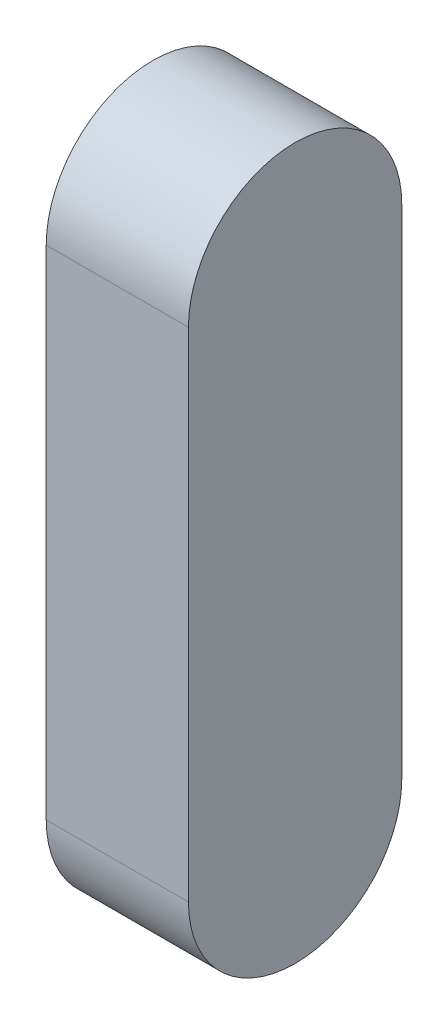
ISO-10303-21;
HEADER;
FILE_DESCRIPTION(('STEP AP214'),'2;1');
FILE_NAME('part.step','',(''),(''),'','','');
FILE_SCHEMA(('AUTOMOTIVE_DESIGN { 1 0 10303 214 1 1 1 1 }'));
ENDSEC;
DATA;
#1=APPLICATION_CONTEXT('core data for automotive mechanical design processes');
#2=APPLICATION_PROTOCOL_DEFINITION('international standard','automotive_design',2000,#1);
#3=PRODUCT_CONTEXT('',#1,'mechanical');
#4=PRODUCT('Part','Part','',(#3));
#5=PRODUCT_RELATED_PRODUCT_CATEGORY('part','',(#4));
#6=PRODUCT_DEFINITION_FORMATION('','',#4);
#7=PRODUCT_DEFINITION_CONTEXT('part definition',#1,'design');
#8=PRODUCT_DEFINITION('design','',#6,#7);
#9=PRODUCT_DEFINITION_SHAPE('','',#8);
#10=(LENGTH_UNIT() NAMED_UNIT(*) SI_UNIT(.MILLI.,.METRE.));
#11=(NAMED_UNIT(*) PLANE_ANGLE_UNIT() SI_UNIT($,.RADIAN.));
#12=(NAMED_UNIT(*) SI_UNIT($,.STERADIAN.) SOLID_ANGLE_UNIT());
#13=UNCERTAINTY_MEASURE_WITH_UNIT(LENGTH_MEASURE(1.E-05),#10,'distance_accuracy_value','');
#14=(GEOMETRIC_REPRESENTATION_CONTEXT(3) GLOBAL_UNCERTAINTY_ASSIGNED_CONTEXT((#13)) GLOBAL_UNIT_ASSIGNED_CONTEXT((#10,
#11,#12)) REPRESENTATION_CONTEXT('',''));
#15=CARTESIAN_POINT('',(0.,0.,0.));
#16=DIRECTION('',(0.,0.,1.));
#17=DIRECTION('',(1.,0.,0.));
#18=AXIS2_PLACEMENT_3D('',#15,#16,#17);
#19=CARTESIAN_POINT('',(20.,0.,0.));
#20=DIRECTION('',(-1.,0.,0.));
#21=DIRECTION('',(0.,0.,1.));
#22=AXIS2_PLACEMENT_3D('',#19,#20,#21);
#23=CYLINDRICAL_SURFACE('',#22,15.);
#24=CARTESIAN_POINT('',(0.,0.,0.));
#25=DIRECTION('',(1.,0.,0.));
#26=DIRECTION('',(0.,0.,-1.));
#27=AXIS2_PLACEMENT_3D('',#24,#25,#26);
#28=CIRCLE('',#27,15.);
#29=CARTESIAN_POINT('',(0.,0.,-15.));
#30=VERTEX_POINT('',#29);
#31=CARTESIAN_POINT('',(0.,0.,15.));
#32=VERTEX_POINT('',#31);
#33=EDGE_CURVE('E111',#30,#32,#28,.T.);
#34=ORIENTED_EDGE('',*,*,#33,.T.);
#35=DIRECTION('',(-1.,0.,0.));
#36=VECTOR('',#35,1.);
#37=CARTESIAN_POINT('',(20.,0.,15.));
#38=LINE('',#37,#36);
#39=CARTESIAN_POINT('',(20.,0.,15.));
#40=VERTEX_POINT('',#39);
#41=EDGE_CURVE('E11',#40,#32,#38,.T.);
#42=ORIENTED_EDGE('',*,*,#41,.F.);
#43=CARTESIAN_POINT('',(20.,0.,0.));
#44=DIRECTION('',(1.,0.,0.));
#45=DIRECTION('',(0.,0.,-1.));
#46=AXIS2_PLACEMENT_3D('',#43,#44,#45);
#47=CIRCLE('',#46,15.);
#48=CARTESIAN_POINT('',(20.,0.,-15.));
#49=VERTEX_POINT('',#48);
#50=EDGE_CURVE('E95',#49,#40,#47,.T.);
#51=ORIENTED_EDGE('',*,*,#50,.F.);
#52=DIRECTION('',(-1.,0.,0.));
#53=VECTOR('',#52,1.);
#54=CARTESIAN_POINT('',(20.,0.,-15.));
#55=LINE('',#54,#53);
#56=EDGE_CURVE('E107',#49,#30,#55,.T.);
#57=ORIENTED_EDGE('',*,*,#56,.T.);
#58=EDGE_LOOP('',(#34,#42,#51,#57));
#59=FACE_BOUND('',#58,.T.);
#60=ADVANCED_FACE('F43',(#59),#23,.T.);
#61=CARTESIAN_POINT('',(20.,0.,15.));
#62=DIRECTION('',(0.,0.,-1.));
#63=DIRECTION('',(0.,1.,0.));
#64=AXIS2_PLACEMENT_3D('',#61,#62,#63);
#65=PLANE('',#64);
#66=DIRECTION('',(0.,-1.,0.));
#67=VECTOR('',#66,1.);
#68=CARTESIAN_POINT('',(0.,0.,15.));
#69=LINE('',#68,#67);
#70=CARTESIAN_POINT('',(0.,-70.,15.));
#71=VERTEX_POINT('',#70);
#72=EDGE_CURVE('E100',#32,#71,#69,.T.);
#73=ORIENTED_EDGE('',*,*,#72,.T.);
#74=DIRECTION('',(-1.,0.,0.));
#75=VECTOR('',#74,1.);
#76=CARTESIAN_POINT('',(20.,-70.,15.));
#77=LINE('',#76,#75);
#78=CARTESIAN_POINT('',(20.,-70.,15.));
#79=VERTEX_POINT('',#78);
#80=EDGE_CURVE('E52',#79,#71,#77,.T.);
#81=ORIENTED_EDGE('',*,*,#80,.F.);
#82=DIRECTION('',(0.,-1.,0.));
#83=VECTOR('',#82,1.);
#84=CARTESIAN_POINT('',(20.,0.,15.));
#85=LINE('',#84,#83);
#86=EDGE_CURVE('E90',#40,#79,#85,.T.);
#87=ORIENTED_EDGE('',*,*,#86,.F.);
#88=ORIENTED_EDGE('',*,*,#41,.T.);
#89=EDGE_LOOP('',(#73,#81,#87,#88));
#90=FACE_BOUND('',#89,.T.);
#91=ADVANCED_FACE('F99',(#90),#65,.F.);
#92=CARTESIAN_POINT('',(20.,-70.,0.));
#93=DIRECTION('',(-1.,0.,0.));
#94=DIRECTION('',(0.,0.,1.));
#95=AXIS2_PLACEMENT_3D('',#92,#93,#94);
#96=CYLINDRICAL_SURFACE('',#95,15.);
#97=CARTESIAN_POINT('',(0.,-70.,0.));
#98=DIRECTION('',(1.,0.,0.));
#99=DIRECTION('',(0.,0.,-1.));
#100=AXIS2_PLACEMENT_3D('',#97,#98,#99);
#101=CIRCLE('',#100,15.);
#102=CARTESIAN_POINT('',(0.,-70.,-15.));
#103=VERTEX_POINT('',#102);
#104=EDGE_CURVE('E77',#71,#103,#101,.T.);
#105=ORIENTED_EDGE('',*,*,#104,.T.);
#106=DIRECTION('',(-1.,0.,0.));
#107=VECTOR('',#106,1.);
#108=CARTESIAN_POINT('',(20.,-70.,-15.));
#109=LINE('',#108,#107);
#110=CARTESIAN_POINT('',(20.,-70.,-15.));
#111=VERTEX_POINT('',#110);
#112=EDGE_CURVE('E102',#111,#103,#109,.T.);
#113=ORIENTED_EDGE('',*,*,#112,.F.);
#114=CARTESIAN_POINT('',(20.,-70.,0.));
#115=DIRECTION('',(1.,0.,0.));
#116=DIRECTION('',(0.,0.,-1.));
#117=AXIS2_PLACEMENT_3D('',#114,#115,#116);
#118=CIRCLE('',#117,15.);
#119=EDGE_CURVE('E93',#79,#111,#118,.T.);
#120=ORIENTED_EDGE('',*,*,#119,.F.);
#121=ORIENTED_EDGE('',*,*,#80,.T.);
#122=EDGE_LOOP('',(#105,#113,#120,#121));
#123=FACE_BOUND('',#122,.T.);
#124=ADVANCED_FACE('F103',(#123),#96,.T.);
#125=CARTESIAN_POINT('',(20.,0.,-15.));
#126=DIRECTION('',(0.,0.,1.));
#127=DIRECTION('',(0.,-1.,0.));
#128=AXIS2_PLACEMENT_3D('',#125,#126,#127);
#129=PLANE('',#128);
#130=DIRECTION('',(0.,1.,0.));
#131=VECTOR('',#130,1.);
#132=CARTESIAN_POINT('',(0.,0.,-15.));
#133=LINE('',#132,#131);
#134=EDGE_CURVE('E83',#103,#30,#133,.T.);
#135=ORIENTED_EDGE('',*,*,#134,.T.);
#136=ORIENTED_EDGE('',*,*,#56,.F.);
#137=DIRECTION('',(0.,1.,0.));
#138=VECTOR('',#137,1.);
#139=CARTESIAN_POINT('',(20.,0.,-15.));
#140=LINE('',#139,#138);
#141=EDGE_CURVE('E60',#111,#49,#140,.T.);
#142=ORIENTED_EDGE('',*,*,#141,.F.);
#143=ORIENTED_EDGE('',*,*,#112,.T.);
#144=EDGE_LOOP('',(#135,#136,#142,#143));
#145=FACE_BOUND('',#144,.T.);
#146=ADVANCED_FACE('F124',(#145),#129,.F.);
#147=CARTESIAN_POINT('',(20.,0.,0.));
#148=DIRECTION('',(1.,0.,0.));
#149=DIRECTION('',(0.,0.,-1.));
#150=AXIS2_PLACEMENT_3D('',#147,#148,#149);
#151=PLANE('',#150);
#152=ORIENTED_EDGE('',*,*,#50,.T.);
#153=ORIENTED_EDGE('',*,*,#86,.T.);
#154=ORIENTED_EDGE('',*,*,#119,.T.);
#155=ORIENTED_EDGE('',*,*,#141,.T.);
#156=EDGE_LOOP('',(#152,#153,#154,#155));
#157=FACE_BOUND('',#156,.T.);
#158=ADVANCED_FACE('F91',(#157),#151,.T.);
#159=CARTESIAN_POINT('',(0.,0.,0.));
#160=DIRECTION('',(1.,0.,0.));
#161=DIRECTION('',(0.,0.,-1.));
#162=AXIS2_PLACEMENT_3D('',#159,#160,#161);
#163=PLANE('',#162);
#164=ORIENTED_EDGE('',*,*,#33,.F.);
#165=ORIENTED_EDGE('',*,*,#134,.F.);
#166=ORIENTED_EDGE('',*,*,#104,.F.);
#167=ORIENTED_EDGE('',*,*,#72,.F.);
#168=EDGE_LOOP('',(#164,#165,#166,#167));
#169=FACE_BOUND('',#168,.T.);
#170=ADVANCED_FACE('F127',(#169),#163,.F.);
#171=CLOSED_SHELL('',(#60,#91,#124,#146,#158,#170));
#172=MANIFOLD_SOLID_BREP('B2',#171);
#173=ADVANCED_BREP_SHAPE_REPRESENTATION('',(#18,#172),#14);
#174=SHAPE_DEFINITION_REPRESENTATION(#9,#173);
ENDSEC;
END-ISO-10303-21;
